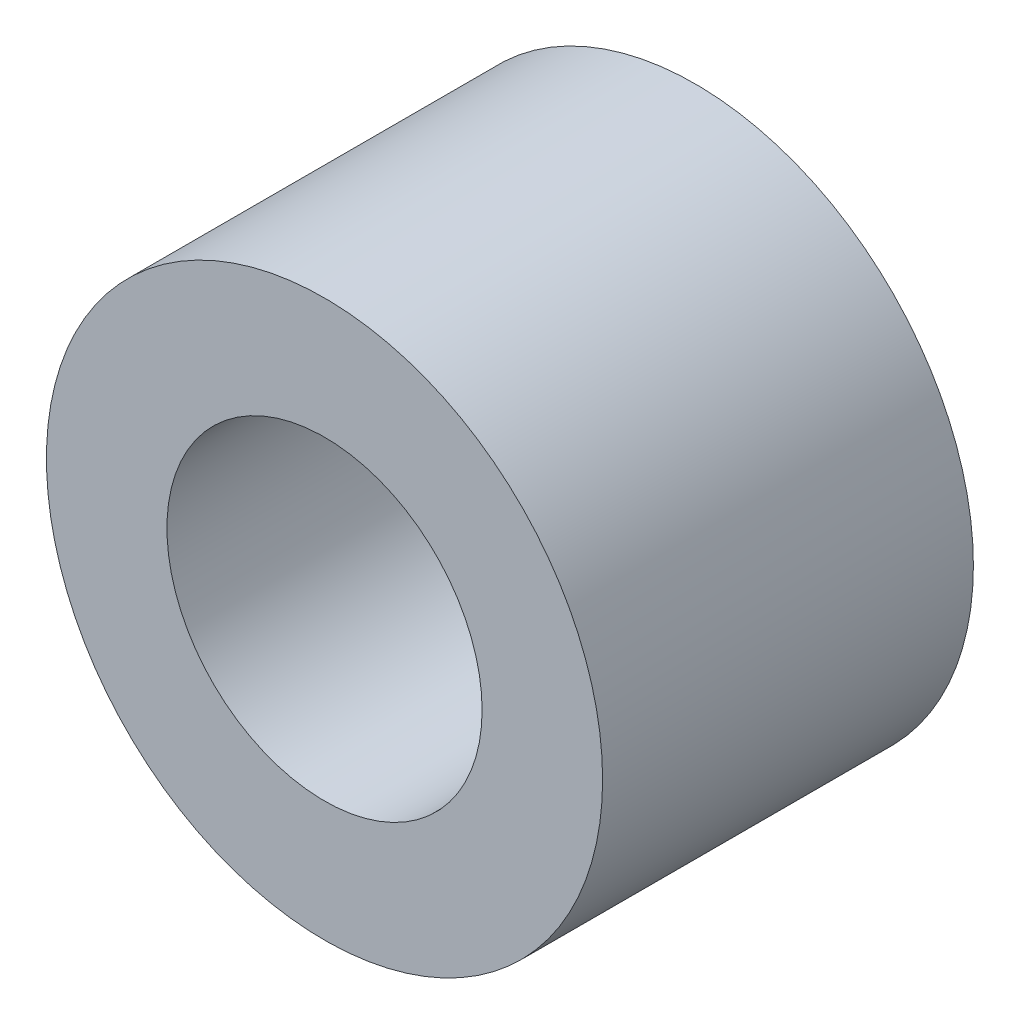
ISO-10303-21;
HEADER;
FILE_DESCRIPTION(('STEP AP214'),'2;1');
FILE_NAME('part.step','',(''),(''),'','','');
FILE_SCHEMA(('AUTOMOTIVE_DESIGN { 1 0 10303 214 1 1 1 1 }'));
ENDSEC;
DATA;
#1=APPLICATION_CONTEXT('core data for automotive mechanical design processes');
#2=APPLICATION_PROTOCOL_DEFINITION('international standard','automotive_design',2000,#1);
#3=PRODUCT_CONTEXT('',#1,'mechanical');
#4=PRODUCT('Part','Part','',(#3));
#5=PRODUCT_RELATED_PRODUCT_CATEGORY('part','',(#4));
#6=PRODUCT_DEFINITION_FORMATION('','',#4);
#7=PRODUCT_DEFINITION_CONTEXT('part definition',#1,'design');
#8=PRODUCT_DEFINITION('design','',#6,#7);
#9=PRODUCT_DEFINITION_SHAPE('','',#8);
#10=(LENGTH_UNIT() NAMED_UNIT(*) SI_UNIT(.MILLI.,.METRE.));
#11=(NAMED_UNIT(*) PLANE_ANGLE_UNIT() SI_UNIT($,.RADIAN.));
#12=(NAMED_UNIT(*) SI_UNIT($,.STERADIAN.) SOLID_ANGLE_UNIT());
#13=UNCERTAINTY_MEASURE_WITH_UNIT(LENGTH_MEASURE(1.E-05),#10,'distance_accuracy_value','');
#14=(GEOMETRIC_REPRESENTATION_CONTEXT(3) GLOBAL_UNCERTAINTY_ASSIGNED_CONTEXT((#13)) GLOBAL_UNIT_ASSIGNED_CONTEXT((#10,
#11,#12)) REPRESENTATION_CONTEXT('',''));
#15=CARTESIAN_POINT('',(0.,0.,0.));
#16=DIRECTION('',(0.,0.,1.));
#17=DIRECTION('',(1.,0.,0.));
#18=AXIS2_PLACEMENT_3D('',#15,#16,#17);
#19=CARTESIAN_POINT('',(0.,0.,4.));
#20=DIRECTION('',(0.,0.,1.));
#21=DIRECTION('',(1.,0.,0.));
#22=AXIS2_PLACEMENT_3D('',#19,#20,#21);
#23=PLANE('',#22);
#24=CARTESIAN_POINT('',(0.,0.,4.));
#25=DIRECTION('',(0.,0.,1.));
#26=DIRECTION('',(1.,0.,0.));
#27=AXIS2_PLACEMENT_3D('',#24,#25,#26);
#28=CIRCLE('',#27,3.);
#29=CARTESIAN_POINT('',(3.,0.,4.));
#30=VERTEX_POINT('',#29);
#31=EDGE_CURVE('E10',#30,#30,#28,.T.);
#32=ORIENTED_EDGE('',*,*,#31,.T.);
#33=EDGE_LOOP('',(#32));
#34=FACE_BOUND('',#33,.T.);
#35=CARTESIAN_POINT('',(0.,0.,4.));
#36=DIRECTION('',(0.,0.,1.));
#37=DIRECTION('',(1.,0.,0.));
#38=AXIS2_PLACEMENT_3D('',#35,#36,#37);
#39=CIRCLE('',#38,1.7);
#40=CARTESIAN_POINT('',(1.7,0.,4.));
#41=VERTEX_POINT('',#40);
#42=EDGE_CURVE('E48',#41,#41,#39,.T.);
#43=ORIENTED_EDGE('',*,*,#42,.F.);
#44=EDGE_LOOP('',(#43));
#45=FACE_BOUND('',#44,.T.);
#46=ADVANCED_FACE('F40',(#34,#45),#23,.T.);
#47=CARTESIAN_POINT('',(0.,0.,0.));
#48=DIRECTION('',(0.,0.,1.));
#49=DIRECTION('',(1.,0.,0.));
#50=AXIS2_PLACEMENT_3D('',#47,#48,#49);
#51=PLANE('',#50);
#52=CARTESIAN_POINT('',(0.,0.,0.));
#53=DIRECTION('',(0.,0.,1.));
#54=DIRECTION('',(1.,0.,0.));
#55=AXIS2_PLACEMENT_3D('',#52,#53,#54);
#56=CIRCLE('',#55,3.);
#57=CARTESIAN_POINT('',(3.,0.,0.));
#58=VERTEX_POINT('',#57);
#59=EDGE_CURVE('E41',#58,#58,#56,.T.);
#60=ORIENTED_EDGE('',*,*,#59,.F.);
#61=EDGE_LOOP('',(#60));
#62=FACE_BOUND('',#61,.T.);
#63=CARTESIAN_POINT('',(0.,0.,0.));
#64=DIRECTION('',(0.,0.,1.));
#65=DIRECTION('',(1.,0.,0.));
#66=AXIS2_PLACEMENT_3D('',#63,#64,#65);
#67=CIRCLE('',#66,1.7);
#68=CARTESIAN_POINT('',(1.7,0.,0.));
#69=VERTEX_POINT('',#68);
#70=EDGE_CURVE('E49',#69,#69,#67,.T.);
#71=ORIENTED_EDGE('',*,*,#70,.T.);
#72=EDGE_LOOP('',(#71));
#73=FACE_BOUND('',#72,.T.);
#74=ADVANCED_FACE('F58',(#62,#73),#51,.F.);
#75=CARTESIAN_POINT('',(0.,0.,4.));
#76=DIRECTION('',(0.,0.,-1.));
#77=DIRECTION('',(-1.,0.,0.));
#78=AXIS2_PLACEMENT_3D('',#75,#76,#77);
#79=CYLINDRICAL_SURFACE('',#78,3.);
#80=ORIENTED_EDGE('',*,*,#31,.F.);
#81=EDGE_LOOP('',(#80));
#82=FACE_BOUND('',#81,.T.);
#83=ORIENTED_EDGE('',*,*,#59,.T.);
#84=EDGE_LOOP('',(#83));
#85=FACE_BOUND('',#84,.T.);
#86=ADVANCED_FACE('F39',(#82,#85),#79,.T.);
#87=CARTESIAN_POINT('',(0.,0.,4.));
#88=DIRECTION('',(0.,0.,-1.));
#89=DIRECTION('',(-1.,0.,0.));
#90=AXIS2_PLACEMENT_3D('',#87,#88,#89);
#91=CYLINDRICAL_SURFACE('',#90,1.7);
#92=ORIENTED_EDGE('',*,*,#42,.T.);
#93=EDGE_LOOP('',(#92));
#94=FACE_BOUND('',#93,.T.);
#95=ORIENTED_EDGE('',*,*,#70,.F.);
#96=EDGE_LOOP('',(#95));
#97=FACE_BOUND('',#96,.T.);
#98=ADVANCED_FACE('F57',(#94,#97),#91,.F.);
#99=CLOSED_SHELL('',(#46,#74,#86,#98));
#100=MANIFOLD_SOLID_BREP('B2',#99);
#101=ADVANCED_BREP_SHAPE_REPRESENTATION('',(#18,#100),#14);
#102=SHAPE_DEFINITION_REPRESENTATION(#9,#101);
ENDSEC;
END-ISO-10303-21;
